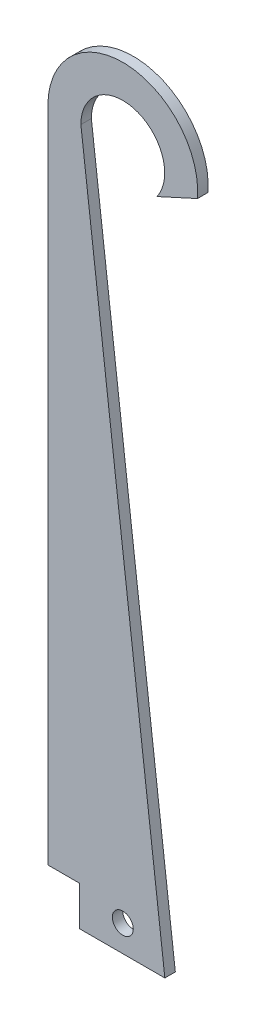
ISO-10303-21;
HEADER;
FILE_DESCRIPTION(('STEP AP214'),'2;1');
FILE_NAME('part.step','',(''),(''),'','','');
FILE_SCHEMA(('AUTOMOTIVE_DESIGN { 1 0 10303 214 1 1 1 1 }'));
ENDSEC;
DATA;
#1=APPLICATION_CONTEXT('core data for automotive mechanical design processes');
#2=APPLICATION_PROTOCOL_DEFINITION('international standard','automotive_design',2000,#1);
#3=PRODUCT_CONTEXT('',#1,'mechanical');
#4=PRODUCT('Part','Part','',(#3));
#5=PRODUCT_RELATED_PRODUCT_CATEGORY('part','',(#4));
#6=PRODUCT_DEFINITION_FORMATION('','',#4);
#7=PRODUCT_DEFINITION_CONTEXT('part definition',#1,'design');
#8=PRODUCT_DEFINITION('design','',#6,#7);
#9=PRODUCT_DEFINITION_SHAPE('','',#8);
#10=(LENGTH_UNIT() NAMED_UNIT(*) SI_UNIT(.MILLI.,.METRE.));
#11=(NAMED_UNIT(*) PLANE_ANGLE_UNIT() SI_UNIT($,.RADIAN.));
#12=(NAMED_UNIT(*) SI_UNIT($,.STERADIAN.) SOLID_ANGLE_UNIT());
#13=UNCERTAINTY_MEASURE_WITH_UNIT(LENGTH_MEASURE(1.E-05),#10,'distance_accuracy_value','');
#14=(GEOMETRIC_REPRESENTATION_CONTEXT(3) GLOBAL_UNCERTAINTY_ASSIGNED_CONTEXT((#13)) GLOBAL_UNIT_ASSIGNED_CONTEXT((#10,
#11,#12)) REPRESENTATION_CONTEXT('',''));
#15=CARTESIAN_POINT('',(0.,0.,0.));
#16=DIRECTION('',(0.,0.,1.));
#17=DIRECTION('',(1.,0.,0.));
#18=AXIS2_PLACEMENT_3D('',#15,#16,#17);
#19=CARTESIAN_POINT('',(-17.3573585994632,404.66044711258,6.35));
#20=DIRECTION('',(0.,0.,-1.));
#21=DIRECTION('',(-1.,0.,0.));
#22=AXIS2_PLACEMENT_3D('',#19,#20,#21);
#23=PLANE('',#22);
#24=CARTESIAN_POINT('',(-17.3573585994632,404.66044711258,6.35));
#25=DIRECTION('',(0.,0.,-1.));
#26=DIRECTION('',(-1.,0.,0.));
#27=AXIS2_PLACEMENT_3D('',#24,#25,#26);
#28=CIRCLE('',#27,25.4);
#29=CARTESIAN_POINT('',(-42.7573585994632,404.66044711258,6.35));
#30=VERTEX_POINT('',#29);
#31=CARTESIAN_POINT('',(3.33112710900608,389.924553549906,6.35));
#32=VERTEX_POINT('',#31);
#33=EDGE_CURVE('E57',#30,#32,#28,.T.);
#34=ORIENTED_EDGE('',*,*,#33,.T.);
#35=DIRECTION('',(0.909444361263456,0.415825629039511,0.));
#36=VECTOR('',#35,1.);
#37=CARTESIAN_POINT('',(3.33112710900608,389.924553549906,6.35));
#38=LINE('',#37,#36);
#39=CARTESIAN_POINT('',(27.9099257899886,401.162728041808,6.35));
#40=VERTEX_POINT('',#39);
#41=EDGE_CURVE('E101',#32,#40,#38,.T.);
#42=ORIENTED_EDGE('',*,*,#41,.T.);
#43=CARTESIAN_POINT('',(-17.3573585994632,404.66044711258,6.35));
#44=DIRECTION('',(0.,0.,1.));
#45=DIRECTION('',(1.,0.,0.));
#46=AXIS2_PLACEMENT_3D('',#43,#44,#45);
#47=CIRCLE('',#46,45.4022144249986);
#48=CARTESIAN_POINT('',(-62.7595730244618,404.66044711258,6.35));
#49=VERTEX_POINT('',#48);
#50=EDGE_CURVE('E187',#40,#49,#47,.T.);
#51=ORIENTED_EDGE('',*,*,#50,.T.);
#52=DIRECTION('',(0.,-1.,0.));
#53=VECTOR('',#52,1.);
#54=CARTESIAN_POINT('',(-62.7595730244618,404.66044711258,6.35));
#55=LINE('',#54,#53);
#56=CARTESIAN_POINT('',(-62.7595730244618,6.09017964299815,6.35));
#57=VERTEX_POINT('',#56);
#58=EDGE_CURVE('E202',#49,#57,#55,.T.);
#59=ORIENTED_EDGE('',*,*,#58,.T.);
#60=DIRECTION('',(1.,0.,0.));
#61=VECTOR('',#60,1.);
#62=CARTESIAN_POINT('',(-43.7152583539215,6.09017964299815,6.35));
#63=LINE('',#62,#61);
#64=CARTESIAN_POINT('',(-43.7152583539215,6.09017964299815,6.35));
#65=VERTEX_POINT('',#64);
#66=EDGE_CURVE('E121',#57,#65,#63,.T.);
#67=ORIENTED_EDGE('',*,*,#66,.T.);
#68=DIRECTION('',(0.,-1.,0.));
#69=VECTOR('',#68,1.);
#70=CARTESIAN_POINT('',(-43.7152583539215,-17.7858203570019,6.35));
#71=LINE('',#70,#69);
#72=CARTESIAN_POINT('',(-43.7152583539215,-17.7858203570019,6.35));
#73=VERTEX_POINT('',#72);
#74=EDGE_CURVE('E115',#65,#73,#71,.T.);
#75=ORIENTED_EDGE('',*,*,#74,.T.);
#76=DIRECTION('',(1.,0.,0.));
#77=VECTOR('',#76,1.);
#78=CARTESIAN_POINT('',(8.12565323571671,-17.7858203570019,6.35));
#79=LINE('',#78,#77);
#80=CARTESIAN_POINT('',(8.12565323571671,-17.7858203570019,6.35));
#81=VERTEX_POINT('',#80);
#82=EDGE_CURVE('E119',#73,#81,#79,.T.);
#83=ORIENTED_EDGE('',*,*,#82,.T.);
#84=DIRECTION('',(-0.119584152365184,0.992824068253334,0.));
#85=VECTOR('',#84,1.);
#86=CARTESIAN_POINT('',(-42.7573585994632,404.66044711258,6.35));
#87=LINE('',#86,#85);
#88=EDGE_CURVE('E138',#81,#30,#87,.T.);
#89=ORIENTED_EDGE('',*,*,#88,.T.);
#90=EDGE_LOOP('',(#34,#42,#51,#59,#67,#75,#83,#89));
#91=FACE_BOUND('',#90,.T.);
#92=CARTESIAN_POINT('',(-17.3573585994632,-1.73955288741989,6.35));
#93=DIRECTION('',(0.,0.,1.));
#94=DIRECTION('',(1.,0.,0.));
#95=AXIS2_PLACEMENT_3D('',#92,#93,#94);
#96=CIRCLE('',#95,6.35);
#97=CARTESIAN_POINT('',(-11.0073585994632,-1.73955288741989,6.35));
#98=VERTEX_POINT('',#97);
#99=EDGE_CURVE('E149',#98,#98,#96,.T.);
#100=ORIENTED_EDGE('',*,*,#99,.F.);
#101=EDGE_LOOP('',(#100));
#102=FACE_BOUND('',#101,.T.);
#103=ADVANCED_FACE('F39',(#91,#102),#23,.F.);
#104=CARTESIAN_POINT('',(-17.3573585994632,404.66044711258,0.));
#105=DIRECTION('',(0.,0.,-1.));
#106=DIRECTION('',(-1.,0.,0.));
#107=AXIS2_PLACEMENT_3D('',#104,#105,#106);
#108=PLANE('',#107);
#109=DIRECTION('',(0.909444361263456,0.415825629039511,0.));
#110=VECTOR('',#109,1.);
#111=CARTESIAN_POINT('',(3.33112710900608,389.924553549906,0.));
#112=LINE('',#111,#110);
#113=CARTESIAN_POINT('',(3.33112710900608,389.924553549906,0.));
#114=VERTEX_POINT('',#113);
#115=CARTESIAN_POINT('',(27.9099257899886,401.162728041808,0.));
#116=VERTEX_POINT('',#115);
#117=EDGE_CURVE('E145',#114,#116,#112,.T.);
#118=ORIENTED_EDGE('',*,*,#117,.F.);
#119=CARTESIAN_POINT('',(-17.3573585994632,404.66044711258,0.));
#120=DIRECTION('',(0.,0.,-1.));
#121=DIRECTION('',(1.,0.,0.));
#122=AXIS2_PLACEMENT_3D('',#119,#120,#121);
#123=CIRCLE('',#122,25.4);
#124=CARTESIAN_POINT('',(-42.7573585994632,404.66044711258,0.));
#125=VERTEX_POINT('',#124);
#126=EDGE_CURVE('E164',#125,#114,#123,.T.);
#127=ORIENTED_EDGE('',*,*,#126,.F.);
#128=DIRECTION('',(-0.119584152365184,0.992824068253334,0.));
#129=VECTOR('',#128,1.);
#130=CARTESIAN_POINT('',(-42.7573585994632,404.66044711258,0.));
#131=LINE('',#130,#129);
#132=CARTESIAN_POINT('',(8.12565323571671,-17.7858203570019,0.));
#133=VERTEX_POINT('',#132);
#134=EDGE_CURVE('E94',#133,#125,#131,.T.);
#135=ORIENTED_EDGE('',*,*,#134,.F.);
#136=DIRECTION('',(1.,0.,0.));
#137=VECTOR('',#136,1.);
#138=CARTESIAN_POINT('',(8.12565323571671,-17.7858203570019,0.));
#139=LINE('',#138,#137);
#140=CARTESIAN_POINT('',(-43.7152583539215,-17.7858203570019,0.));
#141=VERTEX_POINT('',#140);
#142=EDGE_CURVE('E87',#141,#133,#139,.T.);
#143=ORIENTED_EDGE('',*,*,#142,.F.);
#144=DIRECTION('',(0.,-1.,0.));
#145=VECTOR('',#144,1.);
#146=CARTESIAN_POINT('',(-43.7152583539215,-17.7858203570019,0.));
#147=LINE('',#146,#145);
#148=CARTESIAN_POINT('',(-43.7152583539215,6.09017964299815,0.));
#149=VERTEX_POINT('',#148);
#150=EDGE_CURVE('E130',#149,#141,#147,.T.);
#151=ORIENTED_EDGE('',*,*,#150,.F.);
#152=DIRECTION('',(1.,0.,0.));
#153=VECTOR('',#152,1.);
#154=CARTESIAN_POINT('',(-43.7152583539215,6.09017964299815,0.));
#155=LINE('',#154,#153);
#156=CARTESIAN_POINT('',(-62.7595730244618,6.09017964299815,0.));
#157=VERTEX_POINT('',#156);
#158=EDGE_CURVE('E155',#157,#149,#155,.T.);
#159=ORIENTED_EDGE('',*,*,#158,.F.);
#160=DIRECTION('',(0.,-1.,0.));
#161=VECTOR('',#160,1.);
#162=CARTESIAN_POINT('',(-62.7595730244618,404.66044711258,0.));
#163=LINE('',#162,#161);
#164=CARTESIAN_POINT('',(-62.7595730244618,404.66044711258,0.));
#165=VERTEX_POINT('',#164);
#166=EDGE_CURVE('E152',#165,#157,#163,.T.);
#167=ORIENTED_EDGE('',*,*,#166,.F.);
#168=CARTESIAN_POINT('',(-17.3573585994632,404.66044711258,0.));
#169=DIRECTION('',(0.,0.,1.));
#170=DIRECTION('',(1.,0.,0.));
#171=AXIS2_PLACEMENT_3D('',#168,#169,#170);
#172=CIRCLE('',#171,45.4022144249986);
#173=EDGE_CURVE('E148',#116,#165,#172,.T.);
#174=ORIENTED_EDGE('',*,*,#173,.F.);
#175=EDGE_LOOP('',(#118,#127,#135,#143,#151,#159,#167,#174));
#176=FACE_BOUND('',#175,.T.);
#177=CARTESIAN_POINT('',(-17.3573585994632,-1.73955288741989,0.));
#178=DIRECTION('',(0.,0.,1.));
#179=DIRECTION('',(1.,0.,0.));
#180=AXIS2_PLACEMENT_3D('',#177,#178,#179);
#181=CIRCLE('',#180,6.35);
#182=CARTESIAN_POINT('',(-11.0073585994632,-1.73955288741989,0.));
#183=VERTEX_POINT('',#182);
#184=EDGE_CURVE('E212',#183,#183,#181,.T.);
#185=ORIENTED_EDGE('',*,*,#184,.T.);
#186=EDGE_LOOP('',(#185));
#187=FACE_BOUND('',#186,.T.);
#188=ADVANCED_FACE('F191',(#176,#187),#108,.T.);
#189=CARTESIAN_POINT('',(3.33112710900608,389.924553549906,6.35));
#190=DIRECTION('',(-0.415825629039511,0.909444361263456,0.));
#191=DIRECTION('',(-0.909444361263456,-0.415825629039511,0.));
#192=AXIS2_PLACEMENT_3D('',#189,#190,#191);
#193=PLANE('',#192);
#194=ORIENTED_EDGE('',*,*,#117,.T.);
#195=DIRECTION('',(0.,0.,-1.));
#196=VECTOR('',#195,1.);
#197=CARTESIAN_POINT('',(27.9099257899886,401.162728041808,6.35));
#198=LINE('',#197,#196);
#199=EDGE_CURVE('E49',#40,#116,#198,.T.);
#200=ORIENTED_EDGE('',*,*,#199,.F.);
#201=ORIENTED_EDGE('',*,*,#41,.F.);
#202=DIRECTION('',(0.,0.,-1.));
#203=VECTOR('',#202,1.);
#204=CARTESIAN_POINT('',(3.33112710900608,389.924553549906,6.35));
#205=LINE('',#204,#203);
#206=EDGE_CURVE('E11',#32,#114,#205,.T.);
#207=ORIENTED_EDGE('',*,*,#206,.T.);
#208=EDGE_LOOP('',(#194,#200,#201,#207));
#209=FACE_BOUND('',#208,.T.);
#210=ADVANCED_FACE('F41',(#209),#193,.F.);
#211=CARTESIAN_POINT('',(-17.3573585994632,404.66044711258,6.35));
#212=DIRECTION('',(0.,0.,-1.));
#213=DIRECTION('',(-1.,0.,0.));
#214=AXIS2_PLACEMENT_3D('',#211,#212,#213);
#215=CYLINDRICAL_SURFACE('',#214,45.4022144249986);
#216=ORIENTED_EDGE('',*,*,#173,.T.);
#217=DIRECTION('',(0.,0.,-1.));
#218=VECTOR('',#217,1.);
#219=CARTESIAN_POINT('',(-62.7595730244618,404.66044711258,6.35));
#220=LINE('',#219,#218);
#221=EDGE_CURVE('E177',#49,#165,#220,.T.);
#222=ORIENTED_EDGE('',*,*,#221,.F.);
#223=ORIENTED_EDGE('',*,*,#50,.F.);
#224=ORIENTED_EDGE('',*,*,#199,.T.);
#225=EDGE_LOOP('',(#216,#222,#223,#224));
#226=FACE_BOUND('',#225,.T.);
#227=ADVANCED_FACE('F185',(#226),#215,.T.);
#228=CARTESIAN_POINT('',(-62.7595730244618,404.66044711258,6.35));
#229=DIRECTION('',(1.,0.,0.));
#230=DIRECTION('',(0.,0.,-1.));
#231=AXIS2_PLACEMENT_3D('',#228,#229,#230);
#232=PLANE('',#231);
#233=ORIENTED_EDGE('',*,*,#166,.T.);
#234=DIRECTION('',(0.,0.,-1.));
#235=VECTOR('',#234,1.);
#236=CARTESIAN_POINT('',(-62.7595730244618,6.09017964299815,6.35));
#237=LINE('',#236,#235);
#238=EDGE_CURVE('E173',#57,#157,#237,.T.);
#239=ORIENTED_EDGE('',*,*,#238,.F.);
#240=ORIENTED_EDGE('',*,*,#58,.F.);
#241=ORIENTED_EDGE('',*,*,#221,.T.);
#242=EDGE_LOOP('',(#233,#239,#240,#241));
#243=FACE_BOUND('',#242,.T.);
#244=ADVANCED_FACE('F197',(#243),#232,.F.);
#245=CARTESIAN_POINT('',(-43.7152583539215,6.09017964299815,6.35));
#246=DIRECTION('',(0.,1.,0.));
#247=DIRECTION('',(0.,0.,1.));
#248=AXIS2_PLACEMENT_3D('',#245,#246,#247);
#249=PLANE('',#248);
#250=ORIENTED_EDGE('',*,*,#158,.T.);
#251=DIRECTION('',(0.,0.,-1.));
#252=VECTOR('',#251,1.);
#253=CARTESIAN_POINT('',(-43.7152583539215,6.09017964299815,6.35));
#254=LINE('',#253,#252);
#255=EDGE_CURVE('E132',#65,#149,#254,.T.);
#256=ORIENTED_EDGE('',*,*,#255,.F.);
#257=ORIENTED_EDGE('',*,*,#66,.F.);
#258=ORIENTED_EDGE('',*,*,#238,.T.);
#259=EDGE_LOOP('',(#250,#256,#257,#258));
#260=FACE_BOUND('',#259,.T.);
#261=ADVANCED_FACE('F200',(#260),#249,.F.);
#262=CARTESIAN_POINT('',(-43.7152583539215,-17.7858203570019,6.35));
#263=DIRECTION('',(1.,0.,0.));
#264=DIRECTION('',(0.,0.,-1.));
#265=AXIS2_PLACEMENT_3D('',#262,#263,#264);
#266=PLANE('',#265);
#267=ORIENTED_EDGE('',*,*,#150,.T.);
#268=DIRECTION('',(0.,0.,-1.));
#269=VECTOR('',#268,1.);
#270=CARTESIAN_POINT('',(-43.7152583539215,-17.7858203570019,6.35));
#271=LINE('',#270,#269);
#272=EDGE_CURVE('E127',#73,#141,#271,.T.);
#273=ORIENTED_EDGE('',*,*,#272,.F.);
#274=ORIENTED_EDGE('',*,*,#74,.F.);
#275=ORIENTED_EDGE('',*,*,#255,.T.);
#276=EDGE_LOOP('',(#267,#273,#274,#275));
#277=FACE_BOUND('',#276,.T.);
#278=ADVANCED_FACE('F128',(#277),#266,.F.);
#279=CARTESIAN_POINT('',(8.12565323571671,-17.7858203570019,6.35));
#280=DIRECTION('',(0.,1.,0.));
#281=DIRECTION('',(-1.,0.,0.));
#282=AXIS2_PLACEMENT_3D('',#279,#280,#281);
#283=PLANE('',#282);
#284=ORIENTED_EDGE('',*,*,#142,.T.);
#285=DIRECTION('',(0.,0.,-1.));
#286=VECTOR('',#285,1.);
#287=CARTESIAN_POINT('',(8.12565323571671,-17.7858203570019,6.35));
#288=LINE('',#287,#286);
#289=EDGE_CURVE('E133',#81,#133,#288,.T.);
#290=ORIENTED_EDGE('',*,*,#289,.F.);
#291=ORIENTED_EDGE('',*,*,#82,.F.);
#292=ORIENTED_EDGE('',*,*,#272,.T.);
#293=EDGE_LOOP('',(#284,#290,#291,#292));
#294=FACE_BOUND('',#293,.T.);
#295=ADVANCED_FACE('F135',(#294),#283,.F.);
#296=CARTESIAN_POINT('',(-42.7573585994632,404.66044711258,6.35));
#297=DIRECTION('',(-0.992824068253334,-0.119584152365184,0.));
#298=DIRECTION('',(0.119584152365184,-0.992824068253334,0.));
#299=AXIS2_PLACEMENT_3D('',#296,#297,#298);
#300=PLANE('',#299);
#301=ORIENTED_EDGE('',*,*,#134,.T.);
#302=DIRECTION('',(0.,0.,-1.));
#303=VECTOR('',#302,1.);
#304=CARTESIAN_POINT('',(-42.7573585994632,404.66044711258,6.35));
#305=LINE('',#304,#303);
#306=EDGE_CURVE('E141',#30,#125,#305,.T.);
#307=ORIENTED_EDGE('',*,*,#306,.F.);
#308=ORIENTED_EDGE('',*,*,#88,.F.);
#309=ORIENTED_EDGE('',*,*,#289,.T.);
#310=EDGE_LOOP('',(#301,#307,#308,#309));
#311=FACE_BOUND('',#310,.T.);
#312=ADVANCED_FACE('F233',(#311),#300,.F.);
#313=CARTESIAN_POINT('',(-17.3573585994632,404.66044711258,6.35));
#314=DIRECTION('',(0.,0.,-1.));
#315=DIRECTION('',(-1.,0.,0.));
#316=AXIS2_PLACEMENT_3D('',#313,#314,#315);
#317=CYLINDRICAL_SURFACE('',#316,25.4);
#318=ORIENTED_EDGE('',*,*,#126,.T.);
#319=ORIENTED_EDGE('',*,*,#206,.F.);
#320=ORIENTED_EDGE('',*,*,#33,.F.);
#321=ORIENTED_EDGE('',*,*,#306,.T.);
#322=EDGE_LOOP('',(#318,#319,#320,#321));
#323=FACE_BOUND('',#322,.T.);
#324=ADVANCED_FACE('F230',(#323),#317,.F.);
#325=CARTESIAN_POINT('',(-17.3573585994632,-1.73955288741989,6.35));
#326=DIRECTION('',(0.,0.,-1.));
#327=DIRECTION('',(-1.,0.,0.));
#328=AXIS2_PLACEMENT_3D('',#325,#326,#327);
#329=CYLINDRICAL_SURFACE('',#328,6.35);
#330=ORIENTED_EDGE('',*,*,#99,.T.);
#331=EDGE_LOOP('',(#330));
#332=FACE_BOUND('',#331,.T.);
#333=ORIENTED_EDGE('',*,*,#184,.F.);
#334=EDGE_LOOP('',(#333));
#335=FACE_BOUND('',#334,.T.);
#336=ADVANCED_FACE('F220',(#332,#335),#329,.F.);
#337=CLOSED_SHELL('',(#103,#188,#210,#227,#244,#261,#278,#295,#312,#324,#336));
#338=MANIFOLD_SOLID_BREP('B2',#337);
#339=ADVANCED_BREP_SHAPE_REPRESENTATION('',(#18,#338),#14);
#340=SHAPE_DEFINITION_REPRESENTATION(#9,#339);
ENDSEC;
END-ISO-10303-21;
